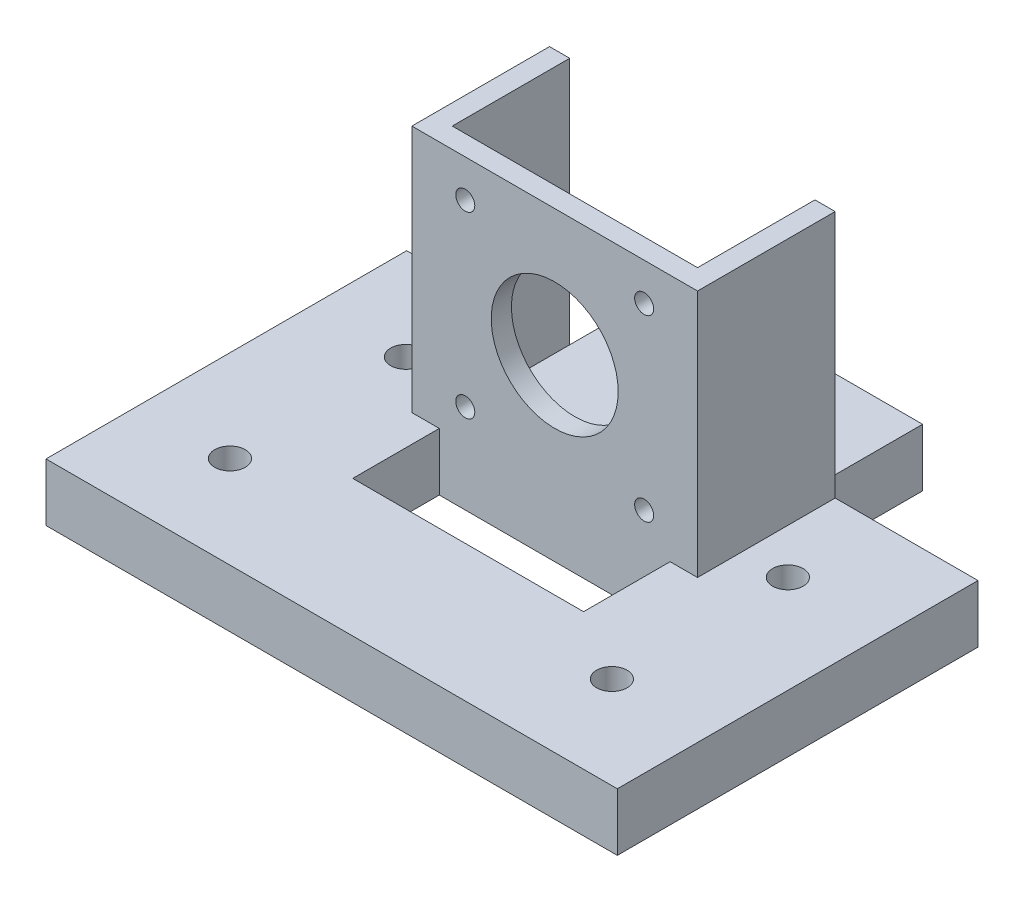
ISO-10303-21;
HEADER;
FILE_DESCRIPTION(('STEP AP214'),'2;1');
FILE_NAME('part.step','',(''),(''),'','','');
FILE_SCHEMA(('AUTOMOTIVE_DESIGN { 1 0 10303 214 1 1 1 1 }'));
ENDSEC;
DATA;
#1=APPLICATION_CONTEXT('core data for automotive mechanical design processes');
#2=APPLICATION_PROTOCOL_DEFINITION('international standard','automotive_design',2000,#1);
#3=PRODUCT_CONTEXT('',#1,'mechanical');
#4=PRODUCT('Part','Part','',(#3));
#5=PRODUCT_RELATED_PRODUCT_CATEGORY('part','',(#4));
#6=PRODUCT_DEFINITION_FORMATION('','',#4);
#7=PRODUCT_DEFINITION_CONTEXT('part definition',#1,'design');
#8=PRODUCT_DEFINITION('design','',#6,#7);
#9=PRODUCT_DEFINITION_SHAPE('','',#8);
#10=(LENGTH_UNIT() NAMED_UNIT(*) SI_UNIT(.MILLI.,.METRE.));
#11=(NAMED_UNIT(*) PLANE_ANGLE_UNIT() SI_UNIT($,.RADIAN.));
#12=(NAMED_UNIT(*) SI_UNIT($,.STERADIAN.) SOLID_ANGLE_UNIT());
#13=UNCERTAINTY_MEASURE_WITH_UNIT(LENGTH_MEASURE(1.E-05),#10,'distance_accuracy_value','');
#14=(GEOMETRIC_REPRESENTATION_CONTEXT(3) GLOBAL_UNCERTAINTY_ASSIGNED_CONTEXT((#13)) GLOBAL_UNIT_ASSIGNED_CONTEXT((#10,
#11,#12)) REPRESENTATION_CONTEXT('',''));
#15=CARTESIAN_POINT('',(0.,0.,0.));
#16=DIRECTION('',(0.,0.,1.));
#17=DIRECTION('',(1.,0.,0.));
#18=AXIS2_PLACEMENT_3D('',#15,#16,#17);
#19=CARTESIAN_POINT('',(0.,10.,0.));
#20=DIRECTION('',(0.,1.,0.));
#21=DIRECTION('',(0.,0.,1.));
#22=AXIS2_PLACEMENT_3D('',#19,#20,#21);
#23=PLANE('',#22);
#24=DIRECTION('',(0.,0.,-1.));
#25=VECTOR('',#24,1.);
#26=CARTESIAN_POINT('',(54.25,10.,0.));
#27=LINE('',#26,#25);
#28=CARTESIAN_POINT('',(54.25,10.,-62.5));
#29=VERTEX_POINT('',#28);
#30=CARTESIAN_POINT('',(54.25,10.,-81.15));
#31=VERTEX_POINT('',#30);
#32=EDGE_CURVE('E195',#29,#31,#27,.T.);
#33=ORIENTED_EDGE('',*,*,#32,.F.);
#34=DIRECTION('',(0.,0.,-1.));
#35=VECTOR('',#34,1.);
#36=CARTESIAN_POINT('',(54.25,10.,-38.65));
#37=LINE('',#36,#35);
#38=CARTESIAN_POINT('',(54.25,10.,-42.15));
#39=VERTEX_POINT('',#38);
#40=EDGE_CURVE('E234',#39,#29,#37,.T.);
#41=ORIENTED_EDGE('',*,*,#40,.F.);
#42=DIRECTION('',(1.,0.,0.));
#43=VECTOR('',#42,1.);
#44=CARTESIAN_POINT('',(0.,10.,-42.15));
#45=LINE('',#44,#43);
#46=CARTESIAN_POINT('',(96.75,10.,-42.15));
#47=VERTEX_POINT('',#46);
#48=EDGE_CURVE('E312',#39,#47,#45,.T.);
#49=ORIENTED_EDGE('',*,*,#48,.T.);
#50=DIRECTION('',(0.,0.,1.));
#51=VECTOR('',#50,1.);
#52=CARTESIAN_POINT('',(96.75,10.,-38.65));
#53=LINE('',#52,#51);
#54=CARTESIAN_POINT('',(96.75,10.,-62.5));
#55=VERTEX_POINT('',#54);
#56=EDGE_CURVE('E238',#55,#47,#53,.T.);
#57=ORIENTED_EDGE('',*,*,#56,.F.);
#58=DIRECTION('',(0.,0.,1.));
#59=VECTOR('',#58,1.);
#60=CARTESIAN_POINT('',(96.75,10.,0.));
#61=LINE('',#60,#59);
#62=CARTESIAN_POINT('',(96.75,10.,-81.15));
#63=VERTEX_POINT('',#62);
#64=EDGE_CURVE('E332',#63,#55,#61,.T.);
#65=ORIENTED_EDGE('',*,*,#64,.F.);
#66=DIRECTION('',(-1.,0.,0.));
#67=VECTOR('',#66,1.);
#68=CARTESIAN_POINT('',(54.25,10.,-81.15));
#69=LINE('',#68,#67);
#70=EDGE_CURVE('E203',#63,#31,#69,.T.);
#71=ORIENTED_EDGE('',*,*,#70,.T.);
#72=EDGE_LOOP('',(#33,#41,#49,#57,#65,#71));
#73=FACE_BOUND('',#72,.T.);
#74=ADVANCED_FACE('F47',(#73),#23,.T.);
#75=CARTESIAN_POINT('',(108.05464,10.,-16.));
#76=DIRECTION('',(0.,1.,0.));
#77=DIRECTION('',(0.,0.,1.));
#78=AXIS2_PLACEMENT_3D('',#75,#76,#77);
#79=CIRCLE('',#78,2.65);
#80=CARTESIAN_POINT('',(108.05464,10.,-13.35));
#81=VERTEX_POINT('',#80);
#82=EDGE_CURVE('E347',#81,#81,#79,.T.);
#83=ORIENTED_EDGE('',*,*,#82,.F.);
#84=EDGE_LOOP('',(#83));
#85=FACE_BOUND('',#84,.T.);
#86=CARTESIAN_POINT('',(41.87366,10.,-16.));
#87=DIRECTION('',(0.,1.,0.));
#88=DIRECTION('',(0.,0.,1.));
#89=AXIS2_PLACEMENT_3D('',#86,#87,#88);
#90=CIRCLE('',#89,2.65);
#91=CARTESIAN_POINT('',(41.87366,10.,-13.35));
#92=VERTEX_POINT('',#91);
#93=EDGE_CURVE('E351',#92,#92,#90,.T.);
#94=ORIENTED_EDGE('',*,*,#93,.F.);
#95=EDGE_LOOP('',(#94));
#96=FACE_BOUND('',#95,.T.);
#97=CARTESIAN_POINT('',(41.87366,10.,-46.5));
#98=DIRECTION('',(0.,1.,0.));
#99=DIRECTION('',(0.,0.,1.));
#100=AXIS2_PLACEMENT_3D('',#97,#98,#99);
#101=CIRCLE('',#100,2.65);
#102=CARTESIAN_POINT('',(41.87366,10.,-43.85));
#103=VERTEX_POINT('',#102);
#104=EDGE_CURVE('E356',#103,#103,#101,.T.);
#105=ORIENTED_EDGE('',*,*,#104,.F.);
#106=EDGE_LOOP('',(#105));
#107=FACE_BOUND('',#106,.T.);
#108=CARTESIAN_POINT('',(108.05464,10.,-46.5));
#109=DIRECTION('',(0.,1.,0.));
#110=DIRECTION('',(0.,0.,1.));
#111=AXIS2_PLACEMENT_3D('',#108,#109,#110);
#112=CIRCLE('',#111,2.65);
#113=CARTESIAN_POINT('',(108.05464,10.,-43.85));
#114=VERTEX_POINT('',#113);
#115=EDGE_CURVE('E360',#114,#114,#112,.T.);
#116=ORIENTED_EDGE('',*,*,#115,.F.);
#117=EDGE_LOOP('',(#116));
#118=FACE_BOUND('',#117,.T.);
#119=DIRECTION('',(1.,0.,0.));
#120=VECTOR('',#119,1.);
#121=CARTESIAN_POINT('',(0.,10.,-38.65));
#122=LINE('',#121,#120);
#123=CARTESIAN_POINT('',(50.75,10.,-38.65));
#124=VERTEX_POINT('',#123);
#125=CARTESIAN_POINT('',(55.5,10.,-38.65));
#126=VERTEX_POINT('',#125);
#127=EDGE_CURVE('E59',#124,#126,#122,.T.);
#128=ORIENTED_EDGE('',*,*,#127,.F.);
#129=DIRECTION('',(0.,0.,1.));
#130=VECTOR('',#129,1.);
#131=CARTESIAN_POINT('',(50.75,10.,-38.65));
#132=LINE('',#131,#130);
#133=CARTESIAN_POINT('',(50.75,10.,-62.5));
#134=VERTEX_POINT('',#133);
#135=EDGE_CURVE('E230',#134,#124,#132,.T.);
#136=ORIENTED_EDGE('',*,*,#135,.F.);
#137=DIRECTION('',(1.,0.,0.));
#138=VECTOR('',#137,1.);
#139=CARTESIAN_POINT('',(0.,10.,-62.5));
#140=LINE('',#139,#138);
#141=CARTESIAN_POINT('',(26.,10.,-62.5));
#142=VERTEX_POINT('',#141);
#143=EDGE_CURVE('E366',#142,#134,#140,.T.);
#144=ORIENTED_EDGE('',*,*,#143,.F.);
#145=DIRECTION('',(0.,0.,1.));
#146=VECTOR('',#145,1.);
#147=CARTESIAN_POINT('',(26.,10.,0.));
#148=LINE('',#147,#146);
#149=CARTESIAN_POINT('',(26.,10.,0.));
#150=VERTEX_POINT('',#149);
#151=EDGE_CURVE('E370',#142,#150,#148,.T.);
#152=ORIENTED_EDGE('',*,*,#151,.T.);
#153=DIRECTION('',(1.,0.,0.));
#154=VECTOR('',#153,1.);
#155=CARTESIAN_POINT('',(0.,10.,0.));
#156=LINE('',#155,#154);
#157=CARTESIAN_POINT('',(125.,10.,0.));
#158=VERTEX_POINT('',#157);
#159=EDGE_CURVE('E374',#150,#158,#156,.T.);
#160=ORIENTED_EDGE('',*,*,#159,.T.);
#161=DIRECTION('',(0.,0.,1.));
#162=VECTOR('',#161,1.);
#163=CARTESIAN_POINT('',(125.,10.,0.));
#164=LINE('',#163,#162);
#165=CARTESIAN_POINT('',(125.,10.,-62.5));
#166=VERTEX_POINT('',#165);
#167=EDGE_CURVE('E377',#166,#158,#164,.T.);
#168=ORIENTED_EDGE('',*,*,#167,.F.);
#169=DIRECTION('',(1.,0.,0.));
#170=VECTOR('',#169,1.);
#171=CARTESIAN_POINT('',(0.,10.,-62.5));
#172=LINE('',#171,#170);
#173=CARTESIAN_POINT('',(100.25,10.,-62.5));
#174=VERTEX_POINT('',#173);
#175=EDGE_CURVE('E71',#174,#166,#172,.T.);
#176=ORIENTED_EDGE('',*,*,#175,.F.);
#177=DIRECTION('',(0.,0.,-1.));
#178=VECTOR('',#177,1.);
#179=CARTESIAN_POINT('',(100.25,10.,-38.65));
#180=LINE('',#179,#178);
#181=CARTESIAN_POINT('',(100.25,10.,-38.65));
#182=VERTEX_POINT('',#181);
#183=EDGE_CURVE('E252',#182,#174,#180,.T.);
#184=ORIENTED_EDGE('',*,*,#183,.F.);
#185=CARTESIAN_POINT('',(95.5,10.,-38.65));
#186=VERTEX_POINT('',#185);
#187=EDGE_CURVE('E11',#186,#182,#122,.T.);
#188=ORIENTED_EDGE('',*,*,#187,.F.);
#189=DIRECTION('',(0.,0.,1.));
#190=VECTOR('',#189,1.);
#191=CARTESIAN_POINT('',(95.5000000000001,10.,0.));
#192=LINE('',#191,#190);
#193=CARTESIAN_POINT('',(95.5,10.,-23.65));
#194=VERTEX_POINT('',#193);
#195=EDGE_CURVE('E385',#186,#194,#192,.T.);
#196=ORIENTED_EDGE('',*,*,#195,.T.);
#197=DIRECTION('',(1.,0.,0.));
#198=VECTOR('',#197,1.);
#199=CARTESIAN_POINT('',(0.,10.,-23.65));
#200=LINE('',#199,#198);
#201=CARTESIAN_POINT('',(55.5,10.,-23.65));
#202=VERTEX_POINT('',#201);
#203=EDGE_CURVE('E388',#202,#194,#200,.T.);
#204=ORIENTED_EDGE('',*,*,#203,.F.);
#205=DIRECTION('',(0.,0.,1.));
#206=VECTOR('',#205,1.);
#207=CARTESIAN_POINT('',(55.5,10.,0.));
#208=LINE('',#207,#206);
#209=EDGE_CURVE('E381',#126,#202,#208,.T.);
#210=ORIENTED_EDGE('',*,*,#209,.F.);
#211=EDGE_LOOP('',(#128,#136,#144,#152,#160,#168,#176,#184,#188,#196,#204,#210));
#212=FACE_BOUND('',#211,.T.);
#213=ADVANCED_FACE('F503',(#85,#96,#107,#118,#212),#23,.T.);
#214=CARTESIAN_POINT('',(55.5,10.,0.));
#215=DIRECTION('',(1.,0.,0.));
#216=DIRECTION('',(0.,0.,-1.));
#217=AXIS2_PLACEMENT_3D('',#214,#215,#216);
#218=PLANE('',#217);
#219=DIRECTION('',(0.,0.,1.));
#220=VECTOR('',#219,1.);
#221=CARTESIAN_POINT('',(55.5,0.,0.));
#222=LINE('',#221,#220);
#223=CARTESIAN_POINT('',(55.5,0.,-38.65));
#224=VERTEX_POINT('',#223);
#225=CARTESIAN_POINT('',(55.5,0.,-23.65));
#226=VERTEX_POINT('',#225);
#227=EDGE_CURVE('E426',#224,#226,#222,.T.);
#228=ORIENTED_EDGE('',*,*,#227,.F.);
#229=DIRECTION('',(0.,-1.,0.));
#230=VECTOR('',#229,1.);
#231=CARTESIAN_POINT('',(55.5,10.,-38.65));
#232=LINE('',#231,#230);
#233=EDGE_CURVE('E57',#126,#224,#232,.T.);
#234=ORIENTED_EDGE('',*,*,#233,.F.);
#235=ORIENTED_EDGE('',*,*,#209,.T.);
#236=DIRECTION('',(0.,-1.,0.));
#237=VECTOR('',#236,1.);
#238=CARTESIAN_POINT('',(55.5,10.,-23.65));
#239=LINE('',#238,#237);
#240=EDGE_CURVE('E441',#202,#226,#239,.T.);
#241=ORIENTED_EDGE('',*,*,#240,.T.);
#242=EDGE_LOOP('',(#228,#234,#235,#241));
#243=FACE_BOUND('',#242,.T.);
#244=ADVANCED_FACE('F508',(#243),#218,.T.);
#245=CARTESIAN_POINT('',(0.,10.,-38.65));
#246=DIRECTION('',(0.,0.,-1.));
#247=DIRECTION('',(-1.,0.,0.));
#248=AXIS2_PLACEMENT_3D('',#245,#246,#247);
#249=PLANE('',#248);
#250=CARTESIAN_POINT('',(60.,15.5,-38.65));
#251=DIRECTION('',(0.,0.,1.));
#252=DIRECTION('',(1.,0.,0.));
#253=AXIS2_PLACEMENT_3D('',#250,#251,#252);
#254=CIRCLE('',#253,1.65);
#255=CARTESIAN_POINT('',(61.65,15.5,-38.65));
#256=VERTEX_POINT('',#255);
#257=EDGE_CURVE('E275',#256,#256,#254,.T.);
#258=ORIENTED_EDGE('',*,*,#257,.F.);
#259=EDGE_LOOP('',(#258));
#260=FACE_BOUND('',#259,.T.);
#261=CARTESIAN_POINT('',(91.,15.5,-38.65));
#262=DIRECTION('',(0.,0.,1.));
#263=DIRECTION('',(1.,0.,0.));
#264=AXIS2_PLACEMENT_3D('',#261,#262,#263);
#265=CIRCLE('',#264,1.65);
#266=CARTESIAN_POINT('',(92.65,15.5,-38.65));
#267=VERTEX_POINT('',#266);
#268=EDGE_CURVE('E297',#267,#267,#265,.T.);
#269=ORIENTED_EDGE('',*,*,#268,.F.);
#270=EDGE_LOOP('',(#269));
#271=FACE_BOUND('',#270,.T.);
#272=CARTESIAN_POINT('',(91.,46.5,-38.65));
#273=DIRECTION('',(0.,0.,1.));
#274=DIRECTION('',(1.,0.,0.));
#275=AXIS2_PLACEMENT_3D('',#272,#273,#274);
#276=CIRCLE('',#275,1.65);
#277=CARTESIAN_POINT('',(92.65,46.5,-38.65));
#278=VERTEX_POINT('',#277);
#279=EDGE_CURVE('E289',#278,#278,#276,.T.);
#280=ORIENTED_EDGE('',*,*,#279,.F.);
#281=EDGE_LOOP('',(#280));
#282=FACE_BOUND('',#281,.T.);
#283=CARTESIAN_POINT('',(60.,46.5,-38.65));
#284=DIRECTION('',(0.,0.,1.));
#285=DIRECTION('',(1.,0.,0.));
#286=AXIS2_PLACEMENT_3D('',#283,#284,#285);
#287=CIRCLE('',#286,1.65);
#288=CARTESIAN_POINT('',(61.65,46.5,-38.65));
#289=VERTEX_POINT('',#288);
#290=EDGE_CURVE('E281',#289,#289,#287,.T.);
#291=ORIENTED_EDGE('',*,*,#290,.F.);
#292=EDGE_LOOP('',(#291));
#293=FACE_BOUND('',#292,.T.);
#294=CARTESIAN_POINT('',(75.5,31.,-38.65));
#295=DIRECTION('',(0.,0.,1.));
#296=DIRECTION('',(1.,0.,0.));
#297=AXIS2_PLACEMENT_3D('',#294,#295,#296);
#298=CIRCLE('',#297,11.);
#299=CARTESIAN_POINT('',(86.5,31.,-38.65));
#300=VERTEX_POINT('',#299);
#301=EDGE_CURVE('E308',#300,#300,#298,.T.);
#302=ORIENTED_EDGE('',*,*,#301,.F.);
#303=EDGE_LOOP('',(#302));
#304=FACE_BOUND('',#303,.T.);
#305=DIRECTION('',(1.,0.,0.));
#306=VECTOR('',#305,1.);
#307=CARTESIAN_POINT('',(0.,0.,-38.65));
#308=LINE('',#307,#306);
#309=CARTESIAN_POINT('',(95.5,0.,-38.65));
#310=VERTEX_POINT('',#309);
#311=EDGE_CURVE('E430',#224,#310,#308,.T.);
#312=ORIENTED_EDGE('',*,*,#311,.T.);
#313=DIRECTION('',(0.,-1.,0.));
#314=VECTOR('',#313,1.);
#315=CARTESIAN_POINT('',(95.5,10.,-38.65));
#316=LINE('',#315,#314);
#317=EDGE_CURVE('E447',#186,#310,#316,.T.);
#318=ORIENTED_EDGE('',*,*,#317,.F.);
#319=ORIENTED_EDGE('',*,*,#187,.T.);
#320=DIRECTION('',(0.,-1.,0.));
#321=VECTOR('',#320,1.);
#322=CARTESIAN_POINT('',(100.25,53.,-38.65));
#323=LINE('',#322,#321);
#324=CARTESIAN_POINT('',(100.25,53.,-38.65));
#325=VERTEX_POINT('',#324);
#326=EDGE_CURVE('E271',#325,#182,#323,.T.);
#327=ORIENTED_EDGE('',*,*,#326,.F.);
#328=DIRECTION('',(1.,0.,0.));
#329=VECTOR('',#328,1.);
#330=CARTESIAN_POINT('',(0.,53.,-38.65));
#331=LINE('',#330,#329);
#332=CARTESIAN_POINT('',(50.75,53.,-38.65));
#333=VERTEX_POINT('',#332);
#334=EDGE_CURVE('E319',#333,#325,#331,.T.);
#335=ORIENTED_EDGE('',*,*,#334,.F.);
#336=DIRECTION('',(0.,-1.,0.));
#337=VECTOR('',#336,1.);
#338=CARTESIAN_POINT('',(50.75,53.,-38.65));
#339=LINE('',#338,#337);
#340=EDGE_CURVE('E225',#333,#124,#339,.T.);
#341=ORIENTED_EDGE('',*,*,#340,.T.);
#342=ORIENTED_EDGE('',*,*,#127,.T.);
#343=ORIENTED_EDGE('',*,*,#233,.T.);
#344=EDGE_LOOP('',(#312,#318,#319,#327,#335,#341,#342,#343));
#345=FACE_BOUND('',#344,.T.);
#346=ADVANCED_FACE('F523',(#260,#271,#282,#293,#304,#345),#249,.F.);
#347=CARTESIAN_POINT('',(95.5000000000001,10.,0.));
#348=DIRECTION('',(1.,0.,0.));
#349=DIRECTION('',(0.,0.,-1.));
#350=AXIS2_PLACEMENT_3D('',#347,#348,#349);
#351=PLANE('',#350);
#352=DIRECTION('',(0.,0.,1.));
#353=VECTOR('',#352,1.);
#354=CARTESIAN_POINT('',(95.5000000000001,0.,0.));
#355=LINE('',#354,#353);
#356=CARTESIAN_POINT('',(95.5,0.,-23.65));
#357=VERTEX_POINT('',#356);
#358=EDGE_CURVE('E434',#310,#357,#355,.T.);
#359=ORIENTED_EDGE('',*,*,#358,.T.);
#360=DIRECTION('',(0.,-1.,0.));
#361=VECTOR('',#360,1.);
#362=CARTESIAN_POINT('',(95.5,10.,-23.65));
#363=LINE('',#362,#361);
#364=EDGE_CURVE('E444',#194,#357,#363,.T.);
#365=ORIENTED_EDGE('',*,*,#364,.F.);
#366=ORIENTED_EDGE('',*,*,#195,.F.);
#367=ORIENTED_EDGE('',*,*,#317,.T.);
#368=EDGE_LOOP('',(#359,#365,#366,#367));
#369=FACE_BOUND('',#368,.T.);
#370=ADVANCED_FACE('F520',(#369),#351,.F.);
#371=CARTESIAN_POINT('',(0.,10.,-62.5));
#372=DIRECTION('',(0.,0.,-1.));
#373=DIRECTION('',(-1.,0.,0.));
#374=AXIS2_PLACEMENT_3D('',#371,#372,#373);
#375=PLANE('',#374);
#376=DIRECTION('',(1.,0.,0.));
#377=VECTOR('',#376,1.);
#378=CARTESIAN_POINT('',(0.,0.,-62.5));
#379=LINE('',#378,#377);
#380=CARTESIAN_POINT('',(96.75,0.,-62.5));
#381=VERTEX_POINT('',#380);
#382=CARTESIAN_POINT('',(125.,0.,-62.5));
#383=VERTEX_POINT('',#382);
#384=EDGE_CURVE('E408',#381,#383,#379,.T.);
#385=ORIENTED_EDGE('',*,*,#384,.F.);
#386=DIRECTION('',(0.,1.,0.));
#387=VECTOR('',#386,1.);
#388=CARTESIAN_POINT('',(96.75,0.,-62.5));
#389=LINE('',#388,#387);
#390=EDGE_CURVE('E189',#381,#55,#389,.T.);
#391=ORIENTED_EDGE('',*,*,#390,.T.);
#392=DIRECTION('',(0.,-1.,0.));
#393=VECTOR('',#392,1.);
#394=CARTESIAN_POINT('',(96.75,53.,-62.5));
#395=LINE('',#394,#393);
#396=CARTESIAN_POINT('',(96.75,53.,-62.5));
#397=VERTEX_POINT('',#396);
#398=EDGE_CURVE('E258',#397,#55,#395,.T.);
#399=ORIENTED_EDGE('',*,*,#398,.F.);
#400=DIRECTION('',(-1.,0.,0.));
#401=VECTOR('',#400,1.);
#402=CARTESIAN_POINT('',(96.75,53.,-62.5));
#403=LINE('',#402,#401);
#404=CARTESIAN_POINT('',(100.25,53.,-62.5));
#405=VERTEX_POINT('',#404);
#406=EDGE_CURVE('E255',#405,#397,#403,.T.);
#407=ORIENTED_EDGE('',*,*,#406,.F.);
#408=DIRECTION('',(0.,-1.,0.));
#409=VECTOR('',#408,1.);
#410=CARTESIAN_POINT('',(100.25,53.,-62.5));
#411=LINE('',#410,#409);
#412=EDGE_CURVE('E267',#405,#174,#411,.T.);
#413=ORIENTED_EDGE('',*,*,#412,.T.);
#414=ORIENTED_EDGE('',*,*,#175,.T.);
#415=DIRECTION('',(0.,-1.,0.));
#416=VECTOR('',#415,1.);
#417=CARTESIAN_POINT('',(125.,10.,-62.5));
#418=LINE('',#417,#416);
#419=EDGE_CURVE('E392',#166,#383,#418,.T.);
#420=ORIENTED_EDGE('',*,*,#419,.T.);
#421=EDGE_LOOP('',(#385,#391,#399,#407,#413,#414,#420));
#422=FACE_BOUND('',#421,.T.);
#423=ADVANCED_FACE('F486',(#422),#375,.T.);
#424=CARTESIAN_POINT('',(0.,10.,-62.5));
#425=DIRECTION('',(0.,0.,-1.));
#426=DIRECTION('',(-1.,0.,0.));
#427=AXIS2_PLACEMENT_3D('',#424,#425,#426);
#428=PLANE('',#427);
#429=DIRECTION('',(1.,0.,0.));
#430=VECTOR('',#429,1.);
#431=CARTESIAN_POINT('',(0.,0.,-62.5));
#432=LINE('',#431,#430);
#433=CARTESIAN_POINT('',(26.,0.,-62.5));
#434=VERTEX_POINT('',#433);
#435=CARTESIAN_POINT('',(54.25,0.,-62.5));
#436=VERTEX_POINT('',#435);
#437=EDGE_CURVE('E411',#434,#436,#432,.T.);
#438=ORIENTED_EDGE('',*,*,#437,.F.);
#439=DIRECTION('',(0.,-1.,0.));
#440=VECTOR('',#439,1.);
#441=CARTESIAN_POINT('',(26.,10.,-62.5));
#442=LINE('',#441,#440);
#443=EDGE_CURVE('E51',#142,#434,#442,.T.);
#444=ORIENTED_EDGE('',*,*,#443,.F.);
#445=ORIENTED_EDGE('',*,*,#143,.T.);
#446=DIRECTION('',(0.,-1.,0.));
#447=VECTOR('',#446,1.);
#448=CARTESIAN_POINT('',(50.75,53.,-62.5));
#449=LINE('',#448,#447);
#450=CARTESIAN_POINT('',(50.75,53.,-62.5));
#451=VERTEX_POINT('',#450);
#452=EDGE_CURVE('E222',#451,#134,#449,.T.);
#453=ORIENTED_EDGE('',*,*,#452,.F.);
#454=DIRECTION('',(-1.,0.,0.));
#455=VECTOR('',#454,1.);
#456=CARTESIAN_POINT('',(54.25,53.,-62.5));
#457=LINE('',#456,#455);
#458=CARTESIAN_POINT('',(54.25,53.,-62.5));
#459=VERTEX_POINT('',#458);
#460=EDGE_CURVE('E242',#459,#451,#457,.T.);
#461=ORIENTED_EDGE('',*,*,#460,.F.);
#462=DIRECTION('',(0.,-1.,0.));
#463=VECTOR('',#462,1.);
#464=CARTESIAN_POINT('',(54.25,53.,-62.5));
#465=LINE('',#464,#463);
#466=EDGE_CURVE('E217',#459,#29,#465,.T.);
#467=ORIENTED_EDGE('',*,*,#466,.T.);
#468=DIRECTION('',(0.,1.,0.));
#469=VECTOR('',#468,1.);
#470=CARTESIAN_POINT('',(54.25,0.,-62.5));
#471=LINE('',#470,#469);
#472=EDGE_CURVE('E340',#436,#29,#471,.T.);
#473=ORIENTED_EDGE('',*,*,#472,.F.);
#474=EDGE_LOOP('',(#438,#444,#445,#453,#461,#467,#473));
#475=FACE_BOUND('',#474,.T.);
#476=ADVANCED_FACE('F471',(#475),#428,.T.);
#477=CARTESIAN_POINT('',(26.,10.,0.));
#478=DIRECTION('',(1.,0.,0.));
#479=DIRECTION('',(0.,0.,-1.));
#480=AXIS2_PLACEMENT_3D('',#477,#478,#479);
#481=PLANE('',#480);
#482=DIRECTION('',(0.,0.,1.));
#483=VECTOR('',#482,1.);
#484=CARTESIAN_POINT('',(26.,0.,0.));
#485=LINE('',#484,#483);
#486=CARTESIAN_POINT('',(26.,0.,0.));
#487=VERTEX_POINT('',#486);
#488=EDGE_CURVE('E414',#434,#487,#485,.T.);
#489=ORIENTED_EDGE('',*,*,#488,.T.);
#490=DIRECTION('',(0.,-1.,0.));
#491=VECTOR('',#490,1.);
#492=CARTESIAN_POINT('',(26.,10.,0.));
#493=LINE('',#492,#491);
#494=EDGE_CURVE('E457',#150,#487,#493,.T.);
#495=ORIENTED_EDGE('',*,*,#494,.F.);
#496=ORIENTED_EDGE('',*,*,#151,.F.);
#497=ORIENTED_EDGE('',*,*,#443,.T.);
#498=EDGE_LOOP('',(#489,#495,#496,#497));
#499=FACE_BOUND('',#498,.T.);
#500=ADVANCED_FACE('F466',(#499),#481,.F.);
#501=CARTESIAN_POINT('',(0.,10.,0.));
#502=DIRECTION('',(0.,0.,-1.));
#503=DIRECTION('',(-1.,0.,0.));
#504=AXIS2_PLACEMENT_3D('',#501,#502,#503);
#505=PLANE('',#504);
#506=DIRECTION('',(1.,0.,0.));
#507=VECTOR('',#506,1.);
#508=CARTESIAN_POINT('',(0.,0.,0.));
#509=LINE('',#508,#507);
#510=CARTESIAN_POINT('',(125.,0.,0.));
#511=VERTEX_POINT('',#510);
#512=EDGE_CURVE('E418',#487,#511,#509,.T.);
#513=ORIENTED_EDGE('',*,*,#512,.T.);
#514=DIRECTION('',(0.,-1.,0.));
#515=VECTOR('',#514,1.);
#516=CARTESIAN_POINT('',(125.,10.,0.));
#517=LINE('',#516,#515);
#518=EDGE_CURVE('E455',#158,#511,#517,.T.);
#519=ORIENTED_EDGE('',*,*,#518,.F.);
#520=ORIENTED_EDGE('',*,*,#159,.F.);
#521=ORIENTED_EDGE('',*,*,#494,.T.);
#522=EDGE_LOOP('',(#513,#519,#520,#521));
#523=FACE_BOUND('',#522,.T.);
#524=ADVANCED_FACE('F492',(#523),#505,.F.);
#525=CARTESIAN_POINT('',(125.,10.,0.));
#526=DIRECTION('',(1.,0.,0.));
#527=DIRECTION('',(0.,0.,-1.));
#528=AXIS2_PLACEMENT_3D('',#525,#526,#527);
#529=PLANE('',#528);
#530=DIRECTION('',(0.,0.,1.));
#531=VECTOR('',#530,1.);
#532=CARTESIAN_POINT('',(125.,0.,0.));
#533=LINE('',#532,#531);
#534=EDGE_CURVE('E422',#383,#511,#533,.T.);
#535=ORIENTED_EDGE('',*,*,#534,.F.);
#536=ORIENTED_EDGE('',*,*,#419,.F.);
#537=ORIENTED_EDGE('',*,*,#167,.T.);
#538=ORIENTED_EDGE('',*,*,#518,.T.);
#539=EDGE_LOOP('',(#535,#536,#537,#538));
#540=FACE_BOUND('',#539,.T.);
#541=ADVANCED_FACE('F490',(#540),#529,.T.);
#542=CARTESIAN_POINT('',(108.05464,10.,-46.5));
#543=DIRECTION('',(0.,-1.,0.));
#544=DIRECTION('',(0.,0.,-1.));
#545=AXIS2_PLACEMENT_3D('',#542,#543,#544);
#546=CYLINDRICAL_SURFACE('',#545,2.65);
#547=ORIENTED_EDGE('',*,*,#115,.T.);
#548=EDGE_LOOP('',(#547));
#549=FACE_BOUND('',#548,.T.);
#550=CARTESIAN_POINT('',(108.05464,0.,-46.5));
#551=DIRECTION('',(0.,1.,0.));
#552=DIRECTION('',(0.,0.,1.));
#553=AXIS2_PLACEMENT_3D('',#550,#551,#552);
#554=CIRCLE('',#553,2.65);
#555=CARTESIAN_POINT('',(108.05464,0.,-43.85));
#556=VERTEX_POINT('',#555);
#557=EDGE_CURVE('E404',#556,#556,#554,.T.);
#558=ORIENTED_EDGE('',*,*,#557,.F.);
#559=EDGE_LOOP('',(#558));
#560=FACE_BOUND('',#559,.T.);
#561=ADVANCED_FACE('F499',(#549,#560),#546,.F.);
#562=CARTESIAN_POINT('',(41.87366,10.,-46.5));
#563=DIRECTION('',(0.,-1.,0.));
#564=DIRECTION('',(0.,0.,-1.));
#565=AXIS2_PLACEMENT_3D('',#562,#563,#564);
#566=CYLINDRICAL_SURFACE('',#565,2.65);
#567=ORIENTED_EDGE('',*,*,#104,.T.);
#568=EDGE_LOOP('',(#567));
#569=FACE_BOUND('',#568,.T.);
#570=CARTESIAN_POINT('',(41.87366,0.,-46.5));
#571=DIRECTION('',(0.,1.,0.));
#572=DIRECTION('',(0.,0.,1.));
#573=AXIS2_PLACEMENT_3D('',#570,#571,#572);
#574=CIRCLE('',#573,2.65);
#575=CARTESIAN_POINT('',(41.87366,0.,-43.85));
#576=VERTEX_POINT('',#575);
#577=EDGE_CURVE('E400',#576,#576,#574,.T.);
#578=ORIENTED_EDGE('',*,*,#577,.F.);
#579=EDGE_LOOP('',(#578));
#580=FACE_BOUND('',#579,.T.);
#581=ADVANCED_FACE('F619',(#569,#580),#566,.F.);
#582=CARTESIAN_POINT('',(41.87366,10.,-16.));
#583=DIRECTION('',(0.,-1.,0.));
#584=DIRECTION('',(0.,0.,-1.));
#585=AXIS2_PLACEMENT_3D('',#582,#583,#584);
#586=CYLINDRICAL_SURFACE('',#585,2.65);
#587=ORIENTED_EDGE('',*,*,#93,.T.);
#588=EDGE_LOOP('',(#587));
#589=FACE_BOUND('',#588,.T.);
#590=CARTESIAN_POINT('',(41.87366,0.,-16.));
#591=DIRECTION('',(0.,1.,0.));
#592=DIRECTION('',(0.,0.,1.));
#593=AXIS2_PLACEMENT_3D('',#590,#591,#592);
#594=CIRCLE('',#593,2.65);
#595=CARTESIAN_POINT('',(41.87366,0.,-13.35));
#596=VERTEX_POINT('',#595);
#597=EDGE_CURVE('E396',#596,#596,#594,.T.);
#598=ORIENTED_EDGE('',*,*,#597,.F.);
#599=EDGE_LOOP('',(#598));
#600=FACE_BOUND('',#599,.T.);
#601=ADVANCED_FACE('F612',(#589,#600),#586,.F.);
#602=CARTESIAN_POINT('',(108.05464,10.,-16.));
#603=DIRECTION('',(0.,-1.,0.));
#604=DIRECTION('',(0.,0.,-1.));
#605=AXIS2_PLACEMENT_3D('',#602,#603,#604);
#606=CYLINDRICAL_SURFACE('',#605,2.65);
#607=ORIENTED_EDGE('',*,*,#82,.T.);
#608=EDGE_LOOP('',(#607));
#609=FACE_BOUND('',#608,.T.);
#610=CARTESIAN_POINT('',(108.05464,0.,-16.));
#611=DIRECTION('',(0.,1.,0.));
#612=DIRECTION('',(0.,0.,1.));
#613=AXIS2_PLACEMENT_3D('',#610,#611,#612);
#614=CIRCLE('',#613,2.65);
#615=CARTESIAN_POINT('',(108.05464,0.,-13.35));
#616=VERTEX_POINT('',#615);
#617=EDGE_CURVE('E344',#616,#616,#614,.T.);
#618=ORIENTED_EDGE('',*,*,#617,.F.);
#619=EDGE_LOOP('',(#618));
#620=FACE_BOUND('',#619,.T.);
#621=ADVANCED_FACE('F49',(#609,#620),#606,.F.);
#622=CARTESIAN_POINT('',(0.,10.,-23.65));
#623=DIRECTION('',(0.,0.,-1.));
#624=DIRECTION('',(-1.,0.,0.));
#625=AXIS2_PLACEMENT_3D('',#622,#623,#624);
#626=PLANE('',#625);
#627=DIRECTION('',(1.,0.,0.));
#628=VECTOR('',#627,1.);
#629=CARTESIAN_POINT('',(0.,0.,-23.65));
#630=LINE('',#629,#628);
#631=EDGE_CURVE('E352',#226,#357,#630,.T.);
#632=ORIENTED_EDGE('',*,*,#631,.F.);
#633=ORIENTED_EDGE('',*,*,#240,.F.);
#634=ORIENTED_EDGE('',*,*,#203,.T.);
#635=ORIENTED_EDGE('',*,*,#364,.T.);
#636=EDGE_LOOP('',(#632,#633,#634,#635));
#637=FACE_BOUND('',#636,.T.);
#638=ADVANCED_FACE('F515',(#637),#626,.T.);
#639=CARTESIAN_POINT('',(0.,0.,0.));
#640=DIRECTION('',(0.,1.,0.));
#641=DIRECTION('',(0.,0.,1.));
#642=AXIS2_PLACEMENT_3D('',#639,#640,#641);
#643=PLANE('',#642);
#644=ORIENTED_EDGE('',*,*,#617,.T.);
#645=EDGE_LOOP('',(#644));
#646=FACE_BOUND('',#645,.T.);
#647=ORIENTED_EDGE('',*,*,#597,.T.);
#648=EDGE_LOOP('',(#647));
#649=FACE_BOUND('',#648,.T.);
#650=ORIENTED_EDGE('',*,*,#577,.T.);
#651=EDGE_LOOP('',(#650));
#652=FACE_BOUND('',#651,.T.);
#653=ORIENTED_EDGE('',*,*,#557,.T.);
#654=EDGE_LOOP('',(#653));
#655=FACE_BOUND('',#654,.T.);
#656=ORIENTED_EDGE('',*,*,#437,.T.);
#657=DIRECTION('',(0.,0.,-1.));
#658=VECTOR('',#657,1.);
#659=CARTESIAN_POINT('',(54.25,0.,0.));
#660=LINE('',#659,#658);
#661=CARTESIAN_POINT('',(54.25,0.,-81.15));
#662=VERTEX_POINT('',#661);
#663=EDGE_CURVE('E194',#436,#662,#660,.T.);
#664=ORIENTED_EDGE('',*,*,#663,.T.);
#665=DIRECTION('',(-1.,0.,0.));
#666=VECTOR('',#665,1.);
#667=CARTESIAN_POINT('',(54.25,0.,-81.15));
#668=LINE('',#667,#666);
#669=CARTESIAN_POINT('',(96.75,0.,-81.15));
#670=VERTEX_POINT('',#669);
#671=EDGE_CURVE('E201',#670,#662,#668,.T.);
#672=ORIENTED_EDGE('',*,*,#671,.F.);
#673=DIRECTION('',(0.,0.,1.));
#674=VECTOR('',#673,1.);
#675=CARTESIAN_POINT('',(96.75,0.,0.));
#676=LINE('',#675,#674);
#677=EDGE_CURVE('E182',#670,#381,#676,.T.);
#678=ORIENTED_EDGE('',*,*,#677,.T.);
#679=ORIENTED_EDGE('',*,*,#384,.T.);
#680=ORIENTED_EDGE('',*,*,#534,.T.);
#681=ORIENTED_EDGE('',*,*,#512,.F.);
#682=ORIENTED_EDGE('',*,*,#488,.F.);
#683=EDGE_LOOP('',(#656,#664,#672,#678,#679,#680,#681,#682));
#684=FACE_BOUND('',#683,.T.);
#685=ORIENTED_EDGE('',*,*,#227,.T.);
#686=ORIENTED_EDGE('',*,*,#631,.T.);
#687=ORIENTED_EDGE('',*,*,#358,.F.);
#688=ORIENTED_EDGE('',*,*,#311,.F.);
#689=EDGE_LOOP('',(#685,#686,#687,#688));
#690=FACE_BOUND('',#689,.T.);
#691=ADVANCED_FACE('F207',(#646,#649,#652,#655,#684,#690),#643,.F.);
#692=CARTESIAN_POINT('',(96.75,0.,0.));
#693=DIRECTION('',(-1.,0.,0.));
#694=DIRECTION('',(0.,0.,1.));
#695=AXIS2_PLACEMENT_3D('',#692,#693,#694);
#696=PLANE('',#695);
#697=ORIENTED_EDGE('',*,*,#64,.T.);
#698=ORIENTED_EDGE('',*,*,#390,.F.);
#699=ORIENTED_EDGE('',*,*,#677,.F.);
#700=DIRECTION('',(0.,1.,0.));
#701=VECTOR('',#700,1.);
#702=CARTESIAN_POINT('',(96.75,0.,-81.15));
#703=LINE('',#702,#701);
#704=EDGE_CURVE('E186',#670,#63,#703,.T.);
#705=ORIENTED_EDGE('',*,*,#704,.T.);
#706=EDGE_LOOP('',(#697,#698,#699,#705));
#707=FACE_BOUND('',#706,.T.);
#708=ADVANCED_FACE('F185',(#707),#696,.F.);
#709=CARTESIAN_POINT('',(54.25,0.,0.));
#710=DIRECTION('',(1.,0.,0.));
#711=DIRECTION('',(0.,0.,-1.));
#712=AXIS2_PLACEMENT_3D('',#709,#710,#711);
#713=PLANE('',#712);
#714=ORIENTED_EDGE('',*,*,#32,.T.);
#715=DIRECTION('',(0.,1.,0.));
#716=VECTOR('',#715,1.);
#717=CARTESIAN_POINT('',(54.25,0.,-81.15));
#718=LINE('',#717,#716);
#719=EDGE_CURVE('E205',#662,#31,#718,.T.);
#720=ORIENTED_EDGE('',*,*,#719,.F.);
#721=ORIENTED_EDGE('',*,*,#663,.F.);
#722=ORIENTED_EDGE('',*,*,#472,.T.);
#723=EDGE_LOOP('',(#714,#720,#721,#722));
#724=FACE_BOUND('',#723,.T.);
#725=ADVANCED_FACE('F476',(#724),#713,.F.);
#726=CARTESIAN_POINT('',(0.,53.,-42.15));
#727=DIRECTION('',(0.,0.,-1.));
#728=DIRECTION('',(-1.,0.,0.));
#729=AXIS2_PLACEMENT_3D('',#726,#727,#728);
#730=PLANE('',#729);
#731=CARTESIAN_POINT('',(60.,15.5,-42.15));
#732=DIRECTION('',(0.,0.,-1.));
#733=DIRECTION('',(-1.,0.,0.));
#734=AXIS2_PLACEMENT_3D('',#731,#732,#733);
#735=CIRCLE('',#734,1.65);
#736=CARTESIAN_POINT('',(58.35,15.5,-42.15));
#737=VERTEX_POINT('',#736);
#738=EDGE_CURVE('E301',#737,#737,#735,.F.);
#739=ORIENTED_EDGE('',*,*,#738,.T.);
#740=EDGE_LOOP('',(#739));
#741=FACE_BOUND('',#740,.T.);
#742=CARTESIAN_POINT('',(91.,15.5,-42.15));
#743=DIRECTION('',(0.,0.,-1.));
#744=DIRECTION('',(-1.,0.,0.));
#745=AXIS2_PLACEMENT_3D('',#742,#743,#744);
#746=CIRCLE('',#745,1.65);
#747=CARTESIAN_POINT('',(89.35,15.5,-42.15));
#748=VERTEX_POINT('',#747);
#749=EDGE_CURVE('E293',#748,#748,#746,.F.);
#750=ORIENTED_EDGE('',*,*,#749,.T.);
#751=EDGE_LOOP('',(#750));
#752=FACE_BOUND('',#751,.T.);
#753=CARTESIAN_POINT('',(91.,46.5,-42.15));
#754=DIRECTION('',(0.,0.,-1.));
#755=DIRECTION('',(-1.,0.,0.));
#756=AXIS2_PLACEMENT_3D('',#753,#754,#755);
#757=CIRCLE('',#756,1.65);
#758=CARTESIAN_POINT('',(89.35,46.5,-42.15));
#759=VERTEX_POINT('',#758);
#760=EDGE_CURVE('E285',#759,#759,#757,.F.);
#761=ORIENTED_EDGE('',*,*,#760,.T.);
#762=EDGE_LOOP('',(#761));
#763=FACE_BOUND('',#762,.T.);
#764=CARTESIAN_POINT('',(60.,46.5,-42.15));
#765=DIRECTION('',(0.,0.,-1.));
#766=DIRECTION('',(-1.,0.,0.));
#767=AXIS2_PLACEMENT_3D('',#764,#765,#766);
#768=CIRCLE('',#767,1.65);
#769=CARTESIAN_POINT('',(58.35,46.5,-42.15));
#770=VERTEX_POINT('',#769);
#771=EDGE_CURVE('E276',#770,#770,#768,.F.);
#772=ORIENTED_EDGE('',*,*,#771,.T.);
#773=EDGE_LOOP('',(#772));
#774=FACE_BOUND('',#773,.T.);
#775=CARTESIAN_POINT('',(75.5,31.,-42.15));
#776=DIRECTION('',(0.,0.,-1.));
#777=DIRECTION('',(-1.,0.,0.));
#778=AXIS2_PLACEMENT_3D('',#775,#776,#777);
#779=CIRCLE('',#778,11.);
#780=CARTESIAN_POINT('',(64.5,31.,-42.15));
#781=VERTEX_POINT('',#780);
#782=EDGE_CURVE('E280',#781,#781,#779,.F.);
#783=ORIENTED_EDGE('',*,*,#782,.T.);
#784=EDGE_LOOP('',(#783));
#785=FACE_BOUND('',#784,.T.);
#786=ORIENTED_EDGE('',*,*,#48,.F.);
#787=DIRECTION('',(0.,-1.,0.));
#788=VECTOR('',#787,1.);
#789=CARTESIAN_POINT('',(54.25,53.,-42.15));
#790=LINE('',#789,#788);
#791=CARTESIAN_POINT('',(54.25,53.,-42.15));
#792=VERTEX_POINT('',#791);
#793=EDGE_CURVE('E330',#792,#39,#790,.T.);
#794=ORIENTED_EDGE('',*,*,#793,.F.);
#795=DIRECTION('',(1.,0.,0.));
#796=VECTOR('',#795,1.);
#797=CARTESIAN_POINT('',(0.,53.,-42.15));
#798=LINE('',#797,#796);
#799=CARTESIAN_POINT('',(96.75,53.,-42.15));
#800=VERTEX_POINT('',#799);
#801=EDGE_CURVE('E316',#792,#800,#798,.T.);
#802=ORIENTED_EDGE('',*,*,#801,.T.);
#803=DIRECTION('',(0.,-1.,0.));
#804=VECTOR('',#803,1.);
#805=CARTESIAN_POINT('',(96.75,53.,-42.15));
#806=LINE('',#805,#804);
#807=EDGE_CURVE('E322',#800,#47,#806,.T.);
#808=ORIENTED_EDGE('',*,*,#807,.T.);
#809=EDGE_LOOP('',(#786,#794,#802,#808));
#810=FACE_BOUND('',#809,.T.);
#811=ADVANCED_FACE('F551',(#741,#752,#763,#774,#785,#810),#730,.T.);
#812=CARTESIAN_POINT('',(0.,53.,0.));
#813=DIRECTION('',(0.,1.,0.));
#814=DIRECTION('',(0.,0.,1.));
#815=AXIS2_PLACEMENT_3D('',#812,#813,#814);
#816=PLANE('',#815);
#817=ORIENTED_EDGE('',*,*,#801,.F.);
#818=DIRECTION('',(0.,0.,-1.));
#819=VECTOR('',#818,1.);
#820=CARTESIAN_POINT('',(54.25,53.,-38.65));
#821=LINE('',#820,#819);
#822=EDGE_CURVE('E235',#792,#459,#821,.T.);
#823=ORIENTED_EDGE('',*,*,#822,.T.);
#824=ORIENTED_EDGE('',*,*,#460,.T.);
#825=DIRECTION('',(0.,0.,1.));
#826=VECTOR('',#825,1.);
#827=CARTESIAN_POINT('',(50.75,53.,-38.65));
#828=LINE('',#827,#826);
#829=EDGE_CURVE('E229',#451,#333,#828,.T.);
#830=ORIENTED_EDGE('',*,*,#829,.T.);
#831=ORIENTED_EDGE('',*,*,#334,.T.);
#832=DIRECTION('',(0.,0.,-1.));
#833=VECTOR('',#832,1.);
#834=CARTESIAN_POINT('',(100.25,53.,-38.65));
#835=LINE('',#834,#833);
#836=EDGE_CURVE('E251',#325,#405,#835,.T.);
#837=ORIENTED_EDGE('',*,*,#836,.T.);
#838=ORIENTED_EDGE('',*,*,#406,.T.);
#839=DIRECTION('',(0.,0.,1.));
#840=VECTOR('',#839,1.);
#841=CARTESIAN_POINT('',(96.75,53.,-38.65));
#842=LINE('',#841,#840);
#843=EDGE_CURVE('E247',#397,#800,#842,.T.);
#844=ORIENTED_EDGE('',*,*,#843,.T.);
#845=EDGE_LOOP('',(#817,#823,#824,#830,#831,#837,#838,#844));
#846=FACE_BOUND('',#845,.T.);
#847=ADVANCED_FACE('F553',(#846),#816,.T.);
#848=CARTESIAN_POINT('',(75.5,31.,-77.651));
#849=DIRECTION('',(0.,0.,1.));
#850=DIRECTION('',(1.,0.,0.));
#851=AXIS2_PLACEMENT_3D('',#848,#849,#850);
#852=CYLINDRICAL_SURFACE('',#851,11.);
#853=ORIENTED_EDGE('',*,*,#782,.F.);
#854=EDGE_LOOP('',(#853));
#855=FACE_BOUND('',#854,.T.);
#856=ORIENTED_EDGE('',*,*,#301,.T.);
#857=EDGE_LOOP('',(#856));
#858=FACE_BOUND('',#857,.T.);
#859=ADVANCED_FACE('F573',(#855,#858),#852,.F.);
#860=CARTESIAN_POINT('',(60.,46.5,-77.651));
#861=DIRECTION('',(0.,0.,1.));
#862=DIRECTION('',(1.,0.,0.));
#863=AXIS2_PLACEMENT_3D('',#860,#861,#862);
#864=CYLINDRICAL_SURFACE('',#863,1.65);
#865=ORIENTED_EDGE('',*,*,#771,.F.);
#866=EDGE_LOOP('',(#865));
#867=FACE_BOUND('',#866,.T.);
#868=ORIENTED_EDGE('',*,*,#290,.T.);
#869=EDGE_LOOP('',(#868));
#870=FACE_BOUND('',#869,.T.);
#871=ADVANCED_FACE('F569',(#867,#870),#864,.F.);
#872=CARTESIAN_POINT('',(91.,46.5,-77.651));
#873=DIRECTION('',(0.,0.,1.));
#874=DIRECTION('',(1.,0.,0.));
#875=AXIS2_PLACEMENT_3D('',#872,#873,#874);
#876=CYLINDRICAL_SURFACE('',#875,1.65);
#877=ORIENTED_EDGE('',*,*,#760,.F.);
#878=EDGE_LOOP('',(#877));
#879=FACE_BOUND('',#878,.T.);
#880=ORIENTED_EDGE('',*,*,#279,.T.);
#881=EDGE_LOOP('',(#880));
#882=FACE_BOUND('',#881,.T.);
#883=ADVANCED_FACE('F572',(#879,#882),#876,.F.);
#884=CARTESIAN_POINT('',(91.,15.5,-77.651));
#885=DIRECTION('',(0.,0.,1.));
#886=DIRECTION('',(1.,0.,0.));
#887=AXIS2_PLACEMENT_3D('',#884,#885,#886);
#888=CYLINDRICAL_SURFACE('',#887,1.65);
#889=ORIENTED_EDGE('',*,*,#749,.F.);
#890=EDGE_LOOP('',(#889));
#891=FACE_BOUND('',#890,.T.);
#892=ORIENTED_EDGE('',*,*,#268,.T.);
#893=EDGE_LOOP('',(#892));
#894=FACE_BOUND('',#893,.T.);
#895=ADVANCED_FACE('F577',(#891,#894),#888,.F.);
#896=CARTESIAN_POINT('',(60.,15.5,-77.651));
#897=DIRECTION('',(0.,0.,1.));
#898=DIRECTION('',(1.,0.,0.));
#899=AXIS2_PLACEMENT_3D('',#896,#897,#898);
#900=CYLINDRICAL_SURFACE('',#899,1.65);
#901=ORIENTED_EDGE('',*,*,#738,.F.);
#902=EDGE_LOOP('',(#901));
#903=FACE_BOUND('',#902,.T.);
#904=ORIENTED_EDGE('',*,*,#257,.T.);
#905=EDGE_LOOP('',(#904));
#906=FACE_BOUND('',#905,.T.);
#907=ADVANCED_FACE('F565',(#903,#906),#900,.F.);
#908=CARTESIAN_POINT('',(96.75,53.,-38.65));
#909=DIRECTION('',(1.,0.,0.));
#910=DIRECTION('',(0.,0.,-1.));
#911=AXIS2_PLACEMENT_3D('',#908,#909,#910);
#912=PLANE('',#911);
#913=ORIENTED_EDGE('',*,*,#807,.F.);
#914=ORIENTED_EDGE('',*,*,#843,.F.);
#915=ORIENTED_EDGE('',*,*,#398,.T.);
#916=ORIENTED_EDGE('',*,*,#56,.T.);
#917=EDGE_LOOP('',(#913,#914,#915,#916));
#918=FACE_BOUND('',#917,.T.);
#919=ADVANCED_FACE('F483',(#918),#912,.F.);
#920=CARTESIAN_POINT('',(100.25,53.,-38.65));
#921=DIRECTION('',(-1.,0.,0.));
#922=DIRECTION('',(0.,0.,1.));
#923=AXIS2_PLACEMENT_3D('',#920,#921,#922);
#924=PLANE('',#923);
#925=ORIENTED_EDGE('',*,*,#183,.T.);
#926=ORIENTED_EDGE('',*,*,#412,.F.);
#927=ORIENTED_EDGE('',*,*,#836,.F.);
#928=ORIENTED_EDGE('',*,*,#326,.T.);
#929=EDGE_LOOP('',(#925,#926,#927,#928));
#930=FACE_BOUND('',#929,.T.);
#931=ADVANCED_FACE('F557',(#930),#924,.F.);
#932=CARTESIAN_POINT('',(54.25,53.,-38.65));
#933=DIRECTION('',(-1.,0.,0.));
#934=DIRECTION('',(0.,0.,1.));
#935=AXIS2_PLACEMENT_3D('',#932,#933,#934);
#936=PLANE('',#935);
#937=ORIENTED_EDGE('',*,*,#793,.T.);
#938=ORIENTED_EDGE('',*,*,#40,.T.);
#939=ORIENTED_EDGE('',*,*,#466,.F.);
#940=ORIENTED_EDGE('',*,*,#822,.F.);
#941=EDGE_LOOP('',(#937,#938,#939,#940));
#942=FACE_BOUND('',#941,.T.);
#943=ADVANCED_FACE('F547',(#942),#936,.F.);
#944=CARTESIAN_POINT('',(50.75,53.,-38.65));
#945=DIRECTION('',(1.,0.,0.));
#946=DIRECTION('',(0.,0.,-1.));
#947=AXIS2_PLACEMENT_3D('',#944,#945,#946);
#948=PLANE('',#947);
#949=ORIENTED_EDGE('',*,*,#135,.T.);
#950=ORIENTED_EDGE('',*,*,#340,.F.);
#951=ORIENTED_EDGE('',*,*,#829,.F.);
#952=ORIENTED_EDGE('',*,*,#452,.T.);
#953=EDGE_LOOP('',(#949,#950,#951,#952));
#954=FACE_BOUND('',#953,.T.);
#955=ADVANCED_FACE('F542',(#954),#948,.F.);
#956=CARTESIAN_POINT('',(54.25,0.,-81.15));
#957=DIRECTION('',(0.,0.,-1.));
#958=DIRECTION('',(-1.,0.,0.));
#959=AXIS2_PLACEMENT_3D('',#956,#957,#958);
#960=PLANE('',#959);
#961=ORIENTED_EDGE('',*,*,#70,.F.);
#962=ORIENTED_EDGE('',*,*,#704,.F.);
#963=ORIENTED_EDGE('',*,*,#671,.T.);
#964=ORIENTED_EDGE('',*,*,#719,.T.);
#965=EDGE_LOOP('',(#961,#962,#963,#964));
#966=FACE_BOUND('',#965,.T.);
#967=ADVANCED_FACE('F199',(#966),#960,.T.);
#968=CLOSED_SHELL('',(#74,#213,#244,#346,#370,#423,#476,#500,#524,#541,#561,#581,#601,#621,#638,
#691,#708,#725,#811,#847,#859,#871,#883,#895,#907,#919,#931,#943,#955,#967));
#969=MANIFOLD_SOLID_BREP('B2',#968);
#970=ADVANCED_BREP_SHAPE_REPRESENTATION('',(#18,#969),#14);
#971=SHAPE_DEFINITION_REPRESENTATION(#9,#970);
ENDSEC;
END-ISO-10303-21;
